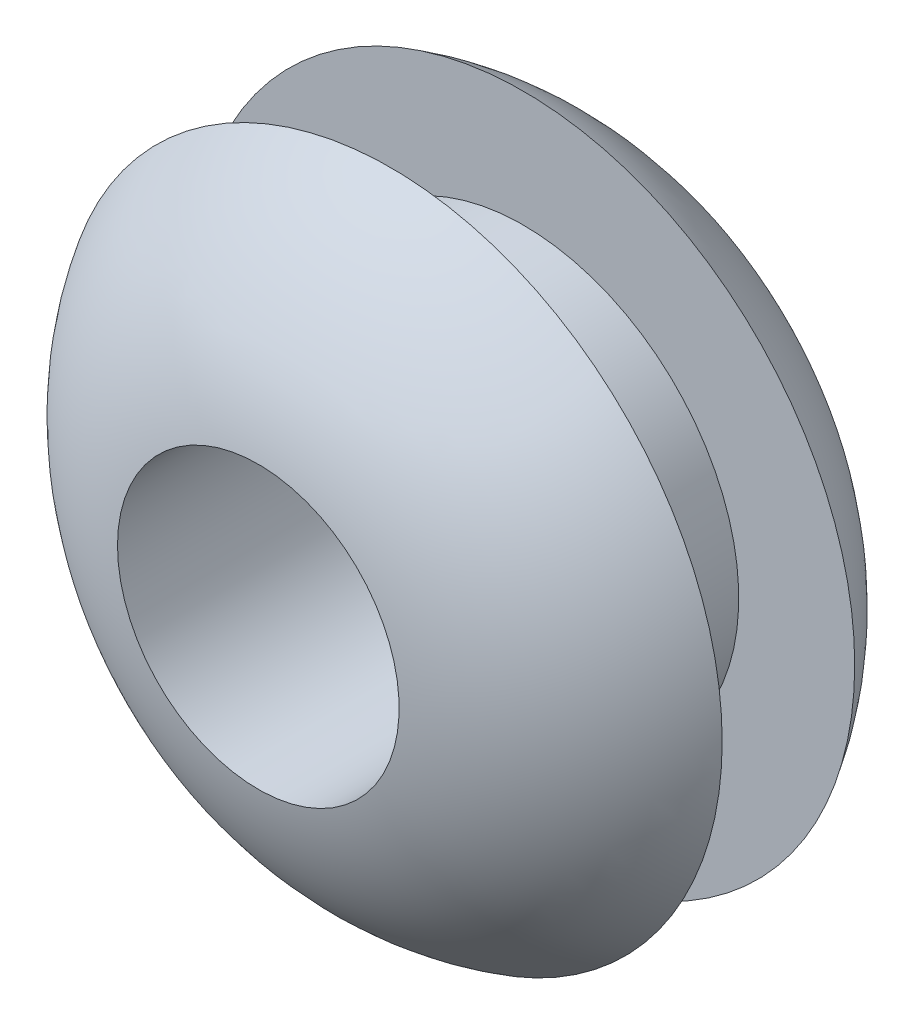
ISO-10303-21;
HEADER;
FILE_DESCRIPTION(('STEP AP214'),'2;1');
FILE_NAME('part.step','',(''),(''),'','','');
FILE_SCHEMA(('AUTOMOTIVE_DESIGN { 1 0 10303 214 1 1 1 1 }'));
ENDSEC;
DATA;
#1=APPLICATION_CONTEXT('core data for automotive mechanical design processes');
#2=APPLICATION_PROTOCOL_DEFINITION('international standard','automotive_design',2000,#1);
#3=PRODUCT_CONTEXT('',#1,'mechanical');
#4=PRODUCT('Part','Part','',(#3));
#5=PRODUCT_RELATED_PRODUCT_CATEGORY('part','',(#4));
#6=PRODUCT_DEFINITION_FORMATION('','',#4);
#7=PRODUCT_DEFINITION_CONTEXT('part definition',#1,'design');
#8=PRODUCT_DEFINITION('design','',#6,#7);
#9=PRODUCT_DEFINITION_SHAPE('','',#8);
#10=(LENGTH_UNIT() NAMED_UNIT(*) SI_UNIT(.MILLI.,.METRE.));
#11=(NAMED_UNIT(*) PLANE_ANGLE_UNIT() SI_UNIT($,.RADIAN.));
#12=(NAMED_UNIT(*) SI_UNIT($,.STERADIAN.) SOLID_ANGLE_UNIT());
#13=UNCERTAINTY_MEASURE_WITH_UNIT(LENGTH_MEASURE(1.E-05),#10,'distance_accuracy_value','');
#14=(GEOMETRIC_REPRESENTATION_CONTEXT(3) GLOBAL_UNCERTAINTY_ASSIGNED_CONTEXT((#13)) GLOBAL_UNIT_ASSIGNED_CONTEXT((#10,
#11,#12)) REPRESENTATION_CONTEXT('',''));
#15=CARTESIAN_POINT('',(0.,0.,0.));
#16=DIRECTION('',(0.,0.,1.));
#17=DIRECTION('',(1.,0.,0.));
#18=AXIS2_PLACEMENT_3D('',#15,#16,#17);
#19=CARTESIAN_POINT('',(0.,0.,10.880889848191));
#20=DIRECTION('',(0.,0.,-1.));
#21=DIRECTION('',(-1.,0.,0.));
#22=AXIS2_PLACEMENT_3D('',#19,#20,#21);
#23=DEGENERATE_TOROIDAL_SURFACE('',#22,2.20202571269778,6.65571995353919,.T.);
#24=CARTESIAN_POINT('',(0.,0.,7.50406548206902));
#25=DIRECTION('',(0.,0.,-1.));
#26=DIRECTION('',(-1.,0.,0.));
#27=AXIS2_PLACEMENT_3D('',#24,#25,#26);
#28=CIRCLE('',#27,7.9375);
#29=CARTESIAN_POINT('',(-7.9375,0.,7.50406548206902));
#30=VERTEX_POINT('',#29);
#31=EDGE_CURVE('E10',#30,#30,#28,.T.);
#32=ORIENTED_EDGE('',*,*,#31,.T.);
#33=EDGE_LOOP('',(#32));
#34=FACE_BOUND('',#33,.T.);
#35=CARTESIAN_POINT('',(0.,0.,4.32906548206902));
#36=DIRECTION('',(0.,0.,-1.));
#37=DIRECTION('',(-1.,0.,0.));
#38=AXIS2_PLACEMENT_3D('',#35,#36,#37);
#39=CIRCLE('',#38,3.3734375);
#40=CARTESIAN_POINT('',(-3.3734375,0.,4.32906548206902));
#41=VERTEX_POINT('',#40);
#42=EDGE_CURVE('E55',#41,#41,#39,.T.);
#43=ORIENTED_EDGE('',*,*,#42,.F.);
#44=EDGE_LOOP('',(#43));
#45=FACE_BOUND('',#44,.T.);
#46=ADVANCED_FACE('F33',(#34,#45),#23,.T.);
#47=CARTESIAN_POINT('',(0.,5.159375,7.50406548206902));
#48=DIRECTION('',(0.,0.,1.));
#49=DIRECTION('',(1.,0.,0.));
#50=AXIS2_PLACEMENT_3D('',#47,#48,#49);
#51=PLANE('',#50);
#52=CARTESIAN_POINT('',(0.,0.,7.50406548206902));
#53=DIRECTION('',(0.,0.,-1.));
#54=DIRECTION('',(-1.,0.,0.));
#55=AXIS2_PLACEMENT_3D('',#52,#53,#54);
#56=CIRCLE('',#55,5.159375);
#57=CARTESIAN_POINT('',(-5.159375,0.,7.50406548206902));
#58=VERTEX_POINT('',#57);
#59=EDGE_CURVE('E39',#58,#58,#56,.T.);
#60=ORIENTED_EDGE('',*,*,#59,.T.);
#61=EDGE_LOOP('',(#60));
#62=FACE_BOUND('',#61,.T.);
#63=ORIENTED_EDGE('',*,*,#31,.F.);
#64=EDGE_LOOP('',(#63));
#65=FACE_BOUND('',#64,.T.);
#66=ADVANCED_FACE('F63',(#62,#65),#51,.T.);
#67=CARTESIAN_POINT('',(0.,0.,0.));
#68=DIRECTION('',(0.,0.,-1.));
#69=DIRECTION('',(-1.,0.,0.));
#70=AXIS2_PLACEMENT_3D('',#67,#68,#69);
#71=CYLINDRICAL_SURFACE('',#70,5.159375);
#72=CARTESIAN_POINT('',(0.,0.,10.679065482069));
#73=DIRECTION('',(0.,0.,-1.));
#74=DIRECTION('',(-1.,0.,0.));
#75=AXIS2_PLACEMENT_3D('',#72,#73,#74);
#76=CIRCLE('',#75,5.159375);
#77=CARTESIAN_POINT('',(-5.159375,0.,10.679065482069));
#78=VERTEX_POINT('',#77);
#79=EDGE_CURVE('E43',#78,#78,#76,.T.);
#80=ORIENTED_EDGE('',*,*,#79,.T.);
#81=EDGE_LOOP('',(#80));
#82=FACE_BOUND('',#81,.T.);
#83=ORIENTED_EDGE('',*,*,#59,.F.);
#84=EDGE_LOOP('',(#83));
#85=FACE_BOUND('',#84,.T.);
#86=ADVANCED_FACE('F67',(#82,#85),#71,.T.);
#87=CARTESIAN_POINT('',(0.,5.159375,10.679065482069));
#88=DIRECTION('',(0.,0.,-1.));
#89=DIRECTION('',(-1.,0.,0.));
#90=AXIS2_PLACEMENT_3D('',#87,#88,#89);
#91=PLANE('',#90);
#92=CARTESIAN_POINT('',(0.,0.,10.679065482069));
#93=DIRECTION('',(0.,0.,-1.));
#94=DIRECTION('',(-1.,0.,0.));
#95=AXIS2_PLACEMENT_3D('',#92,#93,#94);
#96=CIRCLE('',#95,7.9375);
#97=CARTESIAN_POINT('',(-7.9375,0.,10.679065482069));
#98=VERTEX_POINT('',#97);
#99=EDGE_CURVE('E47',#98,#98,#96,.T.);
#100=ORIENTED_EDGE('',*,*,#99,.T.);
#101=EDGE_LOOP('',(#100));
#102=FACE_BOUND('',#101,.T.);
#103=ORIENTED_EDGE('',*,*,#79,.F.);
#104=EDGE_LOOP('',(#103));
#105=FACE_BOUND('',#104,.T.);
#106=ADVANCED_FACE('F71',(#102,#105),#91,.T.);
#107=CARTESIAN_POINT('',(0.,0.,7.30224111594708));
#108=DIRECTION('',(0.,0.,-1.));
#109=DIRECTION('',(-1.,0.,0.));
#110=AXIS2_PLACEMENT_3D('',#107,#108,#109);
#111=DEGENERATE_TOROIDAL_SURFACE('',#110,2.20202571269778,6.65571995353919,.T.);
#112=CARTESIAN_POINT('',(0.,0.,13.854065482069));
#113=DIRECTION('',(0.,0.,-1.));
#114=DIRECTION('',(-1.,0.,0.));
#115=AXIS2_PLACEMENT_3D('',#112,#113,#114);
#116=CIRCLE('',#115,3.3734375);
#117=CARTESIAN_POINT('',(-3.3734375,0.,13.854065482069));
#118=VERTEX_POINT('',#117);
#119=EDGE_CURVE('E52',#118,#118,#116,.T.);
#120=ORIENTED_EDGE('',*,*,#119,.T.);
#121=EDGE_LOOP('',(#120));
#122=FACE_BOUND('',#121,.T.);
#123=ORIENTED_EDGE('',*,*,#99,.F.);
#124=EDGE_LOOP('',(#123));
#125=FACE_BOUND('',#124,.T.);
#126=ADVANCED_FACE('F78',(#122,#125),#111,.T.);
#127=CARTESIAN_POINT('',(0.,0.,0.));
#128=DIRECTION('',(0.,0.,-1.));
#129=DIRECTION('',(-1.,0.,0.));
#130=AXIS2_PLACEMENT_3D('',#127,#128,#129);
#131=CYLINDRICAL_SURFACE('',#130,3.3734375);
#132=ORIENTED_EDGE('',*,*,#42,.T.);
#133=EDGE_LOOP('',(#132));
#134=FACE_BOUND('',#133,.T.);
#135=ORIENTED_EDGE('',*,*,#119,.F.);
#136=EDGE_LOOP('',(#135));
#137=FACE_BOUND('',#136,.T.);
#138=ADVANCED_FACE('F59',(#134,#137),#131,.F.);
#139=CLOSED_SHELL('',(#46,#66,#86,#106,#126,#138));
#140=MANIFOLD_SOLID_BREP('B2',#139);
#141=ADVANCED_BREP_SHAPE_REPRESENTATION('',(#18,#140),#14);
#142=SHAPE_DEFINITION_REPRESENTATION(#9,#141);
ENDSEC;
END-ISO-10303-21;
